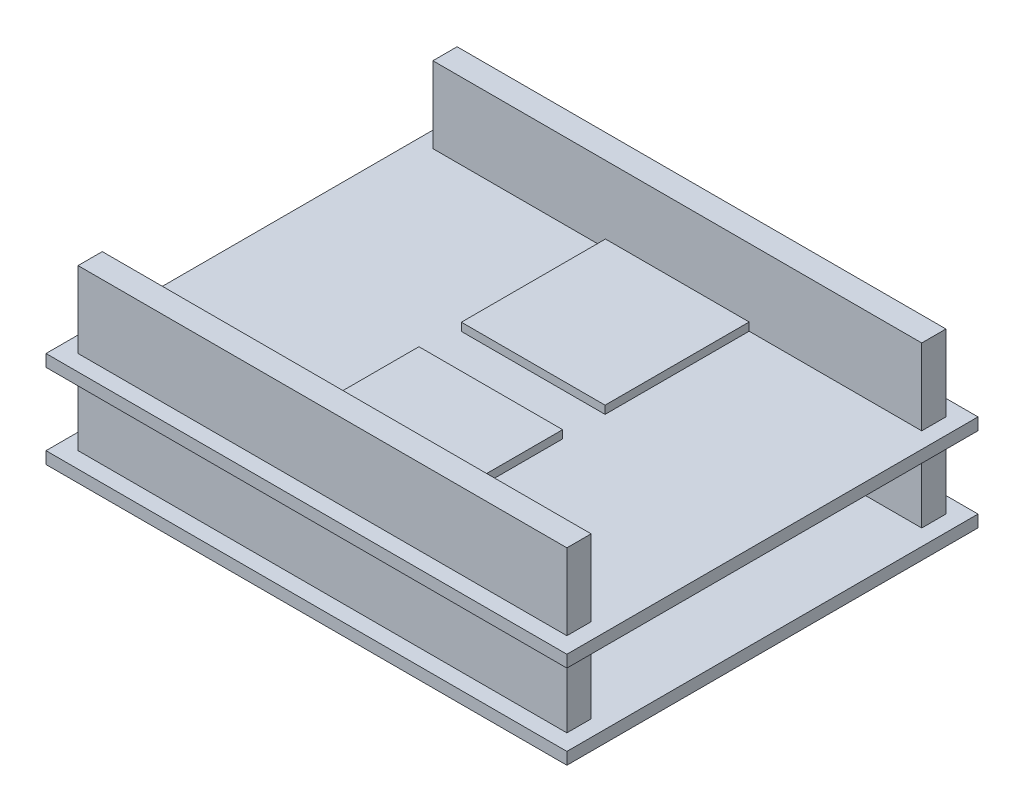
ISO-10303-21;
HEADER;
FILE_DESCRIPTION(('STEP AP214'),'2;1');
FILE_NAME('part.step','',(''),(''),'','','');
FILE_SCHEMA(('AUTOMOTIVE_DESIGN { 1 0 10303 214 1 1 1 1 }'));
ENDSEC;
DATA;
#1=APPLICATION_CONTEXT('core data for automotive mechanical design processes');
#2=APPLICATION_PROTOCOL_DEFINITION('international standard','automotive_design',2000,#1);
#3=PRODUCT_CONTEXT('',#1,'mechanical');
#4=PRODUCT('Part','Part','',(#3));
#5=PRODUCT_RELATED_PRODUCT_CATEGORY('part','',(#4));
#6=PRODUCT_DEFINITION_FORMATION('','',#4);
#7=PRODUCT_DEFINITION_CONTEXT('part definition',#1,'design');
#8=PRODUCT_DEFINITION('design','',#6,#7);
#9=PRODUCT_DEFINITION_SHAPE('','',#8);
#10=(LENGTH_UNIT() NAMED_UNIT(*) SI_UNIT(.MILLI.,.METRE.));
#11=(NAMED_UNIT(*) PLANE_ANGLE_UNIT() SI_UNIT($,.RADIAN.));
#12=(NAMED_UNIT(*) SI_UNIT($,.STERADIAN.) SOLID_ANGLE_UNIT());
#13=UNCERTAINTY_MEASURE_WITH_UNIT(LENGTH_MEASURE(1.E-05),#10,'distance_accuracy_value','');
#14=(GEOMETRIC_REPRESENTATION_CONTEXT(3) GLOBAL_UNCERTAINTY_ASSIGNED_CONTEXT((#13)) GLOBAL_UNIT_ASSIGNED_CONTEXT((#10,
#11,#12)) REPRESENTATION_CONTEXT('',''));
#15=CARTESIAN_POINT('',(0.,0.,0.));
#16=DIRECTION('',(0.,0.,1.));
#17=DIRECTION('',(1.,0.,0.));
#18=AXIS2_PLACEMENT_3D('',#15,#16,#17);
#19=CARTESIAN_POINT('',(0.,1.5,0.));
#20=DIRECTION('',(0.,-1.,0.));
#21=DIRECTION('',(0.,0.,-1.));
#22=AXIS2_PLACEMENT_3D('',#19,#20,#21);
#23=PLANE('',#22);
#24=DIRECTION('',(-1.,0.,0.));
#25=VECTOR('',#24,1.);
#26=CARTESIAN_POINT('',(0.,1.5,20.627385850554));
#27=LINE('',#26,#25);
#28=CARTESIAN_POINT('',(-8.96479878415247,1.5,20.627385850554));
#29=VERTEX_POINT('',#28);
#30=CARTESIAN_POINT('',(-30.5,1.5,20.627385850554));
#31=VERTEX_POINT('',#30);
#32=EDGE_CURVE('E368',#29,#31,#27,.T.);
#33=ORIENTED_EDGE('',*,*,#32,.F.);
#34=DIRECTION('',(0.,0.,1.));
#35=VECTOR('',#34,1.);
#36=CARTESIAN_POINT('',(-8.96479878415247,1.5,20.6499999999998));
#37=LINE('',#36,#35);
#38=CARTESIAN_POINT('',(-8.96479878415238,1.5,2.64999999999977));
#39=VERTEX_POINT('',#38);
#40=EDGE_CURVE('E384',#39,#29,#37,.T.);
#41=ORIENTED_EDGE('',*,*,#40,.F.);
#42=DIRECTION('',(-1.,0.,0.));
#43=VECTOR('',#42,1.);
#44=CARTESIAN_POINT('',(-8.96479878415238,1.5,2.64999999999977));
#45=LINE('',#44,#43);
#46=CARTESIAN_POINT('',(8.96479878415235,1.5,2.64999999999986));
#47=VERTEX_POINT('',#46);
#48=EDGE_CURVE('E391',#47,#39,#45,.T.);
#49=ORIENTED_EDGE('',*,*,#48,.F.);
#50=DIRECTION('',(0.,0.,-1.));
#51=VECTOR('',#50,1.);
#52=CARTESIAN_POINT('',(8.96479878415226,1.5,20.6499999999999));
#53=LINE('',#52,#51);
#54=CARTESIAN_POINT('',(8.96479878415226,1.5,20.627385850554));
#55=VERTEX_POINT('',#54);
#56=EDGE_CURVE('E380',#55,#47,#53,.T.);
#57=ORIENTED_EDGE('',*,*,#56,.F.);
#58=CARTESIAN_POINT('',(30.5,1.5,20.627385850554));
#59=VERTEX_POINT('',#58);
#60=EDGE_CURVE('E370',#59,#55,#27,.T.);
#61=ORIENTED_EDGE('',*,*,#60,.F.);
#62=DIRECTION('',(0.,0.,-1.));
#63=VECTOR('',#62,1.);
#64=CARTESIAN_POINT('',(30.5,1.5,0.));
#65=LINE('',#64,#63);
#66=CARTESIAN_POINT('',(30.5,1.5,23.65));
#67=VERTEX_POINT('',#66);
#68=EDGE_CURVE('E376',#67,#59,#65,.T.);
#69=ORIENTED_EDGE('',*,*,#68,.F.);
#70=DIRECTION('',(1.,0.,0.));
#71=VECTOR('',#70,1.);
#72=CARTESIAN_POINT('',(0.,1.5,23.65));
#73=LINE('',#72,#71);
#74=CARTESIAN_POINT('',(-30.5,1.5,23.65));
#75=VERTEX_POINT('',#74);
#76=EDGE_CURVE('E374',#75,#67,#73,.T.);
#77=ORIENTED_EDGE('',*,*,#76,.F.);
#78=DIRECTION('',(0.,0.,1.));
#79=VECTOR('',#78,1.);
#80=CARTESIAN_POINT('',(-30.5,1.5,0.));
#81=LINE('',#80,#79);
#82=EDGE_CURVE('E378',#31,#75,#81,.T.);
#83=ORIENTED_EDGE('',*,*,#82,.F.);
#84=EDGE_LOOP('',(#33,#41,#49,#57,#61,#69,#77,#83));
#85=FACE_BOUND('',#84,.T.);
#86=DIRECTION('',(0.,0.,1.));
#87=VECTOR('',#86,1.);
#88=CARTESIAN_POINT('',(-32.5,1.5,-25.65));
#89=LINE('',#88,#87);
#90=CARTESIAN_POINT('',(-32.5,1.5,-25.65));
#91=VERTEX_POINT('',#90);
#92=CARTESIAN_POINT('',(-32.5,1.5,25.65));
#93=VERTEX_POINT('',#92);
#94=EDGE_CURVE('E423',#91,#93,#89,.T.);
#95=ORIENTED_EDGE('',*,*,#94,.T.);
#96=DIRECTION('',(1.,0.,0.));
#97=VECTOR('',#96,1.);
#98=CARTESIAN_POINT('',(32.5,1.5,25.65));
#99=LINE('',#98,#97);
#100=CARTESIAN_POINT('',(32.5,1.5,25.65));
#101=VERTEX_POINT('',#100);
#102=EDGE_CURVE('E426',#93,#101,#99,.T.);
#103=ORIENTED_EDGE('',*,*,#102,.T.);
#104=DIRECTION('',(0.,0.,-1.));
#105=VECTOR('',#104,1.);
#106=CARTESIAN_POINT('',(32.5,1.5,-25.65));
#107=LINE('',#106,#105);
#108=CARTESIAN_POINT('',(32.5,1.5,-25.65));
#109=VERTEX_POINT('',#108);
#110=EDGE_CURVE('E429',#101,#109,#107,.T.);
#111=ORIENTED_EDGE('',*,*,#110,.T.);
#112=DIRECTION('',(-1.,0.,0.));
#113=VECTOR('',#112,1.);
#114=CARTESIAN_POINT('',(32.5,1.5,-25.65));
#115=LINE('',#114,#113);
#116=EDGE_CURVE('E431',#109,#91,#115,.T.);
#117=ORIENTED_EDGE('',*,*,#116,.T.);
#118=EDGE_LOOP('',(#95,#103,#111,#117));
#119=FACE_BOUND('',#118,.T.);
#120=DIRECTION('',(1.,0.,0.));
#121=VECTOR('',#120,1.);
#122=CARTESIAN_POINT('',(0.,1.5,-20.627385850554));
#123=LINE('',#122,#121);
#124=CARTESIAN_POINT('',(8.96479878415236,1.5,-20.627385850554));
#125=VERTEX_POINT('',#124);
#126=CARTESIAN_POINT('',(30.5,1.5,-20.627385850554));
#127=VERTEX_POINT('',#126);
#128=EDGE_CURVE('E313',#125,#127,#123,.T.);
#129=ORIENTED_EDGE('',*,*,#128,.F.);
#130=DIRECTION('',(0.,0.,-1.));
#131=VECTOR('',#130,1.);
#132=CARTESIAN_POINT('',(8.96479878415236,1.5,-20.65));
#133=LINE('',#132,#131);
#134=CARTESIAN_POINT('',(8.96479878415237,1.5,-2.65000000000001));
#135=VERTEX_POINT('',#134);
#136=EDGE_CURVE('E401',#135,#125,#133,.T.);
#137=ORIENTED_EDGE('',*,*,#136,.F.);
#138=DIRECTION('',(1.,0.,0.));
#139=VECTOR('',#138,1.);
#140=CARTESIAN_POINT('',(-8.96479878415236,1.5,-2.65000000000001));
#141=LINE('',#140,#139);
#142=CARTESIAN_POINT('',(-8.96479878415236,1.5,-2.65000000000001));
#143=VERTEX_POINT('',#142);
#144=EDGE_CURVE('E406',#143,#135,#141,.T.);
#145=ORIENTED_EDGE('',*,*,#144,.F.);
#146=DIRECTION('',(0.,0.,1.));
#147=VECTOR('',#146,1.);
#148=CARTESIAN_POINT('',(-8.96479878415236,1.5,-20.65));
#149=LINE('',#148,#147);
#150=CARTESIAN_POINT('',(-8.96479878415236,1.5,-20.627385850554));
#151=VERTEX_POINT('',#150);
#152=EDGE_CURVE('E413',#151,#143,#149,.T.);
#153=ORIENTED_EDGE('',*,*,#152,.F.);
#154=CARTESIAN_POINT('',(-30.5,1.5,-20.627385850554));
#155=VERTEX_POINT('',#154);
#156=EDGE_CURVE('E315',#155,#151,#123,.T.);
#157=ORIENTED_EDGE('',*,*,#156,.F.);
#158=DIRECTION('',(0.,0.,1.));
#159=VECTOR('',#158,1.);
#160=CARTESIAN_POINT('',(-30.5,1.5,0.));
#161=LINE('',#160,#159);
#162=CARTESIAN_POINT('',(-30.5,1.5,-23.65));
#163=VERTEX_POINT('',#162);
#164=EDGE_CURVE('E319',#163,#155,#161,.T.);
#165=ORIENTED_EDGE('',*,*,#164,.F.);
#166=DIRECTION('',(-1.,0.,0.));
#167=VECTOR('',#166,1.);
#168=CARTESIAN_POINT('',(0.,1.5,-23.65));
#169=LINE('',#168,#167);
#170=CARTESIAN_POINT('',(30.5,1.5,-23.65));
#171=VERTEX_POINT('',#170);
#172=EDGE_CURVE('E323',#171,#163,#169,.T.);
#173=ORIENTED_EDGE('',*,*,#172,.F.);
#174=DIRECTION('',(0.,0.,-1.));
#175=VECTOR('',#174,1.);
#176=CARTESIAN_POINT('',(30.5,1.5,0.));
#177=LINE('',#176,#175);
#178=EDGE_CURVE('E321',#127,#171,#177,.T.);
#179=ORIENTED_EDGE('',*,*,#178,.F.);
#180=EDGE_LOOP('',(#129,#137,#145,#153,#157,#165,#173,#179));
#181=FACE_BOUND('',#180,.T.);
#182=ADVANCED_FACE('F33',(#85,#119,#181),#23,.F.);
#183=CARTESIAN_POINT('',(0.,0.,0.));
#184=DIRECTION('',(0.,-1.,0.));
#185=DIRECTION('',(0.,0.,-1.));
#186=AXIS2_PLACEMENT_3D('',#183,#184,#185);
#187=PLANE('',#186);
#188=DIRECTION('',(-1.,0.,0.));
#189=VECTOR('',#188,1.);
#190=CARTESIAN_POINT('',(0.,0.,20.627385850554));
#191=LINE('',#190,#189);
#192=CARTESIAN_POINT('',(30.5,0.,20.627385850554));
#193=VERTEX_POINT('',#192);
#194=CARTESIAN_POINT('',(-30.5,0.,20.627385850554));
#195=VERTEX_POINT('',#194);
#196=EDGE_CURVE('E371',#193,#195,#191,.T.);
#197=ORIENTED_EDGE('',*,*,#196,.T.);
#198=DIRECTION('',(0.,0.,1.));
#199=VECTOR('',#198,1.);
#200=CARTESIAN_POINT('',(-30.5,0.,0.));
#201=LINE('',#200,#199);
#202=CARTESIAN_POINT('',(-30.5,0.,23.65));
#203=VERTEX_POINT('',#202);
#204=EDGE_CURVE('E461',#195,#203,#201,.T.);
#205=ORIENTED_EDGE('',*,*,#204,.T.);
#206=DIRECTION('',(1.,0.,0.));
#207=VECTOR('',#206,1.);
#208=CARTESIAN_POINT('',(0.,0.,23.65));
#209=LINE('',#208,#207);
#210=CARTESIAN_POINT('',(30.5,0.,23.65));
#211=VERTEX_POINT('',#210);
#212=EDGE_CURVE('E455',#203,#211,#209,.T.);
#213=ORIENTED_EDGE('',*,*,#212,.T.);
#214=DIRECTION('',(0.,0.,-1.));
#215=VECTOR('',#214,1.);
#216=CARTESIAN_POINT('',(30.5,0.,0.));
#217=LINE('',#216,#215);
#218=EDGE_CURVE('E458',#211,#193,#217,.T.);
#219=ORIENTED_EDGE('',*,*,#218,.T.);
#220=EDGE_LOOP('',(#197,#205,#213,#219));
#221=FACE_BOUND('',#220,.T.);
#222=DIRECTION('',(0.,0.,1.));
#223=VECTOR('',#222,1.);
#224=CARTESIAN_POINT('',(-32.5,0.,-25.65));
#225=LINE('',#224,#223);
#226=CARTESIAN_POINT('',(-32.5,0.,-25.65));
#227=VERTEX_POINT('',#226);
#228=CARTESIAN_POINT('',(-32.5,0.,25.65));
#229=VERTEX_POINT('',#228);
#230=EDGE_CURVE('E422',#227,#229,#225,.T.);
#231=ORIENTED_EDGE('',*,*,#230,.F.);
#232=DIRECTION('',(-1.,0.,0.));
#233=VECTOR('',#232,1.);
#234=CARTESIAN_POINT('',(32.5,0.,-25.65));
#235=LINE('',#234,#233);
#236=CARTESIAN_POINT('',(32.5,0.,-25.65));
#237=VERTEX_POINT('',#236);
#238=EDGE_CURVE('E427',#237,#227,#235,.T.);
#239=ORIENTED_EDGE('',*,*,#238,.F.);
#240=DIRECTION('',(0.,0.,-1.));
#241=VECTOR('',#240,1.);
#242=CARTESIAN_POINT('',(32.5,0.,-25.65));
#243=LINE('',#242,#241);
#244=CARTESIAN_POINT('',(32.5,0.,25.65));
#245=VERTEX_POINT('',#244);
#246=EDGE_CURVE('E438',#245,#237,#243,.T.);
#247=ORIENTED_EDGE('',*,*,#246,.F.);
#248=DIRECTION('',(1.,0.,0.));
#249=VECTOR('',#248,1.);
#250=CARTESIAN_POINT('',(32.5,0.,25.65));
#251=LINE('',#250,#249);
#252=EDGE_CURVE('E436',#229,#245,#251,.T.);
#253=ORIENTED_EDGE('',*,*,#252,.F.);
#254=EDGE_LOOP('',(#231,#239,#247,#253));
#255=FACE_BOUND('',#254,.T.);
#256=DIRECTION('',(0.,0.,-1.));
#257=VECTOR('',#256,1.);
#258=CARTESIAN_POINT('',(30.5,0.,0.));
#259=LINE('',#258,#257);
#260=CARTESIAN_POINT('',(30.5,0.,-20.627385850554));
#261=VERTEX_POINT('',#260);
#262=CARTESIAN_POINT('',(30.5,0.,-23.65));
#263=VERTEX_POINT('',#262);
#264=EDGE_CURVE('E41',#261,#263,#259,.T.);
#265=ORIENTED_EDGE('',*,*,#264,.T.);
#266=DIRECTION('',(-1.,0.,0.));
#267=VECTOR('',#266,1.);
#268=CARTESIAN_POINT('',(0.,0.,-23.65));
#269=LINE('',#268,#267);
#270=CARTESIAN_POINT('',(-30.5,0.,-23.65));
#271=VERTEX_POINT('',#270);
#272=EDGE_CURVE('E11',#263,#271,#269,.T.);
#273=ORIENTED_EDGE('',*,*,#272,.T.);
#274=DIRECTION('',(0.,0.,1.));
#275=VECTOR('',#274,1.);
#276=CARTESIAN_POINT('',(-30.5,0.,0.));
#277=LINE('',#276,#275);
#278=CARTESIAN_POINT('',(-30.5,0.,-20.627385850554));
#279=VERTEX_POINT('',#278);
#280=EDGE_CURVE('E466',#271,#279,#277,.T.);
#281=ORIENTED_EDGE('',*,*,#280,.T.);
#282=DIRECTION('',(1.,0.,0.));
#283=VECTOR('',#282,1.);
#284=CARTESIAN_POINT('',(0.,0.,-20.627385850554));
#285=LINE('',#284,#283);
#286=EDGE_CURVE('E316',#279,#261,#285,.T.);
#287=ORIENTED_EDGE('',*,*,#286,.T.);
#288=EDGE_LOOP('',(#265,#273,#281,#287));
#289=FACE_BOUND('',#288,.T.);
#290=ADVANCED_FACE('F470',(#221,#255,#289),#187,.T.);
#291=CARTESIAN_POINT('',(8.96479878415236,2.5,-20.65));
#292=DIRECTION('',(-1.,0.,0.));
#293=DIRECTION('',(0.,0.,1.));
#294=AXIS2_PLACEMENT_3D('',#291,#292,#293);
#295=PLANE('',#294);
#296=DIRECTION('',(0.,-1.,0.));
#297=VECTOR('',#296,1.);
#298=CARTESIAN_POINT('',(8.96479878415236,2.5,-20.627385850554));
#299=LINE('',#298,#297);
#300=CARTESIAN_POINT('',(8.96479878415237,2.5,-20.627385850554));
#301=VERTEX_POINT('',#300);
#302=EDGE_CURVE('E311',#301,#125,#299,.T.);
#303=ORIENTED_EDGE('',*,*,#302,.F.);
#304=DIRECTION('',(0.,0.,-1.));
#305=VECTOR('',#304,1.);
#306=CARTESIAN_POINT('',(8.96479878415236,2.5,-20.65));
#307=LINE('',#306,#305);
#308=CARTESIAN_POINT('',(8.96479878415237,2.5,-2.65000000000001));
#309=VERTEX_POINT('',#308);
#310=EDGE_CURVE('E402',#309,#301,#307,.T.);
#311=ORIENTED_EDGE('',*,*,#310,.F.);
#312=DIRECTION('',(0.,-1.,0.));
#313=VECTOR('',#312,1.);
#314=CARTESIAN_POINT('',(8.96479878415237,2.5,-2.65000000000001));
#315=LINE('',#314,#313);
#316=EDGE_CURVE('E410',#309,#135,#315,.T.);
#317=ORIENTED_EDGE('',*,*,#316,.T.);
#318=ORIENTED_EDGE('',*,*,#136,.T.);
#319=EDGE_LOOP('',(#303,#311,#317,#318));
#320=FACE_BOUND('',#319,.T.);
#321=ADVANCED_FACE('F504',(#320),#295,.F.);
#322=CARTESIAN_POINT('',(-8.96479878415236,2.5,-20.65));
#323=DIRECTION('',(1.,0.,0.));
#324=DIRECTION('',(0.,0.,-1.));
#325=AXIS2_PLACEMENT_3D('',#322,#323,#324);
#326=PLANE('',#325);
#327=DIRECTION('',(0.,1.,0.));
#328=VECTOR('',#327,1.);
#329=CARTESIAN_POINT('',(-8.96479878415236,2.5,-20.627385850554));
#330=LINE('',#329,#328);
#331=CARTESIAN_POINT('',(-8.96479878415236,2.5,-20.627385850554));
#332=VERTEX_POINT('',#331);
#333=EDGE_CURVE('E56',#151,#332,#330,.T.);
#334=ORIENTED_EDGE('',*,*,#333,.F.);
#335=ORIENTED_EDGE('',*,*,#152,.T.);
#336=DIRECTION('',(0.,-1.,0.));
#337=VECTOR('',#336,1.);
#338=CARTESIAN_POINT('',(-8.96479878415236,2.5,-2.65000000000001));
#339=LINE('',#338,#337);
#340=CARTESIAN_POINT('',(-8.96479878415236,2.5,-2.65000000000001));
#341=VERTEX_POINT('',#340);
#342=EDGE_CURVE('E419',#341,#143,#339,.T.);
#343=ORIENTED_EDGE('',*,*,#342,.F.);
#344=DIRECTION('',(0.,0.,1.));
#345=VECTOR('',#344,1.);
#346=CARTESIAN_POINT('',(-8.96479878415236,2.5,-20.65));
#347=LINE('',#346,#345);
#348=EDGE_CURVE('E405',#332,#341,#347,.T.);
#349=ORIENTED_EDGE('',*,*,#348,.F.);
#350=EDGE_LOOP('',(#334,#335,#343,#349));
#351=FACE_BOUND('',#350,.T.);
#352=ADVANCED_FACE('F556',(#351),#326,.F.);
#353=CARTESIAN_POINT('',(0.,2.5,0.));
#354=DIRECTION('',(0.,1.,0.));
#355=DIRECTION('',(0.,0.,1.));
#356=AXIS2_PLACEMENT_3D('',#353,#354,#355);
#357=PLANE('',#356);
#358=ORIENTED_EDGE('',*,*,#310,.T.);
#359=DIRECTION('',(-1.,0.,0.));
#360=VECTOR('',#359,1.);
#361=CARTESIAN_POINT('',(0.,2.5,-20.627385850554));
#362=LINE('',#361,#360);
#363=EDGE_CURVE('E464',#301,#332,#362,.T.);
#364=ORIENTED_EDGE('',*,*,#363,.T.);
#365=ORIENTED_EDGE('',*,*,#348,.T.);
#366=DIRECTION('',(1.,0.,0.));
#367=VECTOR('',#366,1.);
#368=CARTESIAN_POINT('',(-8.96479878415236,2.5,-2.65000000000001));
#369=LINE('',#368,#367);
#370=EDGE_CURVE('E408',#341,#309,#369,.T.);
#371=ORIENTED_EDGE('',*,*,#370,.T.);
#372=EDGE_LOOP('',(#358,#364,#365,#371));
#373=FACE_BOUND('',#372,.T.);
#374=ADVANCED_FACE('F559',(#373),#357,.T.);
#375=CARTESIAN_POINT('',(8.96479878415226,2.5,20.6499999999999));
#376=DIRECTION('',(-1.,0.,0.));
#377=DIRECTION('',(0.,0.,1.));
#378=AXIS2_PLACEMENT_3D('',#375,#376,#377);
#379=PLANE('',#378);
#380=DIRECTION('',(0.,1.,0.));
#381=VECTOR('',#380,1.);
#382=CARTESIAN_POINT('',(8.96479878415226,2.5,20.627385850554));
#383=LINE('',#382,#381);
#384=CARTESIAN_POINT('',(8.96479878415226,2.5,20.627385850554));
#385=VERTEX_POINT('',#384);
#386=EDGE_CURVE('E366',#55,#385,#383,.T.);
#387=ORIENTED_EDGE('',*,*,#386,.F.);
#388=ORIENTED_EDGE('',*,*,#56,.T.);
#389=DIRECTION('',(0.,-1.,0.));
#390=VECTOR('',#389,1.);
#391=CARTESIAN_POINT('',(8.96479878415235,2.5,2.64999999999986));
#392=LINE('',#391,#390);
#393=CARTESIAN_POINT('',(8.96479878415235,2.5,2.64999999999986));
#394=VERTEX_POINT('',#393);
#395=EDGE_CURVE('E398',#394,#47,#392,.T.);
#396=ORIENTED_EDGE('',*,*,#395,.F.);
#397=DIRECTION('',(0.,0.,-1.));
#398=VECTOR('',#397,1.);
#399=CARTESIAN_POINT('',(8.96479878415226,2.5,20.6499999999999));
#400=LINE('',#399,#398);
#401=EDGE_CURVE('E381',#385,#394,#400,.T.);
#402=ORIENTED_EDGE('',*,*,#401,.F.);
#403=EDGE_LOOP('',(#387,#388,#396,#402));
#404=FACE_BOUND('',#403,.T.);
#405=ADVANCED_FACE('F604',(#404),#379,.F.);
#406=CARTESIAN_POINT('',(-8.96479878415247,2.5,20.6499999999998));
#407=DIRECTION('',(1.,0.,0.));
#408=DIRECTION('',(0.,0.,-1.));
#409=AXIS2_PLACEMENT_3D('',#406,#407,#408);
#410=PLANE('',#409);
#411=DIRECTION('',(0.,-1.,0.));
#412=VECTOR('',#411,1.);
#413=CARTESIAN_POINT('',(-8.96479878415247,2.5,20.627385850554));
#414=LINE('',#413,#412);
#415=CARTESIAN_POINT('',(-8.96479878415247,2.5,20.627385850554));
#416=VERTEX_POINT('',#415);
#417=EDGE_CURVE('E364',#416,#29,#414,.T.);
#418=ORIENTED_EDGE('',*,*,#417,.F.);
#419=DIRECTION('',(0.,0.,1.));
#420=VECTOR('',#419,1.);
#421=CARTESIAN_POINT('',(-8.96479878415247,2.5,20.6499999999998));
#422=LINE('',#421,#420);
#423=CARTESIAN_POINT('',(-8.96479878415238,2.5,2.64999999999977));
#424=VERTEX_POINT('',#423);
#425=EDGE_CURVE('E386',#424,#416,#422,.T.);
#426=ORIENTED_EDGE('',*,*,#425,.F.);
#427=DIRECTION('',(0.,-1.,0.));
#428=VECTOR('',#427,1.);
#429=CARTESIAN_POINT('',(-8.96479878415238,2.5,2.64999999999977));
#430=LINE('',#429,#428);
#431=EDGE_CURVE('E389',#424,#39,#430,.T.);
#432=ORIENTED_EDGE('',*,*,#431,.T.);
#433=ORIENTED_EDGE('',*,*,#40,.T.);
#434=EDGE_LOOP('',(#418,#426,#432,#433));
#435=FACE_BOUND('',#434,.T.);
#436=ADVANCED_FACE('F600',(#435),#410,.F.);
#437=CARTESIAN_POINT('',(0.,2.5,0.));
#438=DIRECTION('',(0.,1.,0.));
#439=DIRECTION('',(0.,0.,1.));
#440=AXIS2_PLACEMENT_3D('',#437,#438,#439);
#441=PLANE('',#440);
#442=ORIENTED_EDGE('',*,*,#425,.T.);
#443=DIRECTION('',(1.,0.,0.));
#444=VECTOR('',#443,1.);
#445=CARTESIAN_POINT('',(0.,2.5,20.627385850554));
#446=LINE('',#445,#444);
#447=EDGE_CURVE('E452',#416,#385,#446,.T.);
#448=ORIENTED_EDGE('',*,*,#447,.T.);
#449=ORIENTED_EDGE('',*,*,#401,.T.);
#450=DIRECTION('',(-1.,0.,0.));
#451=VECTOR('',#450,1.);
#452=CARTESIAN_POINT('',(-8.96479878415238,2.5,2.64999999999977));
#453=LINE('',#452,#451);
#454=EDGE_CURVE('E383',#394,#424,#453,.T.);
#455=ORIENTED_EDGE('',*,*,#454,.T.);
#456=EDGE_LOOP('',(#442,#448,#449,#455));
#457=FACE_BOUND('',#456,.T.);
#458=ADVANCED_FACE('F526',(#457),#441,.T.);
#459=CARTESIAN_POINT('',(-32.5,1.5,-25.65));
#460=DIRECTION('',(1.,0.,0.));
#461=DIRECTION('',(0.,0.,-1.));
#462=AXIS2_PLACEMENT_3D('',#459,#460,#461);
#463=PLANE('',#462);
#464=ORIENTED_EDGE('',*,*,#230,.T.);
#465=DIRECTION('',(0.,-1.,0.));
#466=VECTOR('',#465,1.);
#467=CARTESIAN_POINT('',(-32.5,1.5,25.65));
#468=LINE('',#467,#466);
#469=EDGE_CURVE('E449',#93,#229,#468,.T.);
#470=ORIENTED_EDGE('',*,*,#469,.F.);
#471=ORIENTED_EDGE('',*,*,#94,.F.);
#472=DIRECTION('',(0.,-1.,0.));
#473=VECTOR('',#472,1.);
#474=CARTESIAN_POINT('',(-32.5,1.5,-25.65));
#475=LINE('',#474,#473);
#476=EDGE_CURVE('E433',#91,#227,#475,.T.);
#477=ORIENTED_EDGE('',*,*,#476,.T.);
#478=EDGE_LOOP('',(#464,#470,#471,#477));
#479=FACE_BOUND('',#478,.T.);
#480=ADVANCED_FACE('F35',(#479),#463,.F.);
#481=CARTESIAN_POINT('',(32.5,1.5,25.65));
#482=DIRECTION('',(0.,0.,-1.));
#483=DIRECTION('',(-1.,0.,0.));
#484=AXIS2_PLACEMENT_3D('',#481,#482,#483);
#485=PLANE('',#484);
#486=ORIENTED_EDGE('',*,*,#252,.T.);
#487=DIRECTION('',(0.,-1.,0.));
#488=VECTOR('',#487,1.);
#489=CARTESIAN_POINT('',(32.5,1.5,25.65));
#490=LINE('',#489,#488);
#491=EDGE_CURVE('E446',#101,#245,#490,.T.);
#492=ORIENTED_EDGE('',*,*,#491,.F.);
#493=ORIENTED_EDGE('',*,*,#102,.F.);
#494=ORIENTED_EDGE('',*,*,#469,.T.);
#495=EDGE_LOOP('',(#486,#492,#493,#494));
#496=FACE_BOUND('',#495,.T.);
#497=ADVANCED_FACE('F519',(#496),#485,.F.);
#498=CARTESIAN_POINT('',(32.5,1.5,-25.65));
#499=DIRECTION('',(-1.,0.,0.));
#500=DIRECTION('',(0.,0.,1.));
#501=AXIS2_PLACEMENT_3D('',#498,#499,#500);
#502=PLANE('',#501);
#503=ORIENTED_EDGE('',*,*,#246,.T.);
#504=DIRECTION('',(0.,-1.,0.));
#505=VECTOR('',#504,1.);
#506=CARTESIAN_POINT('',(32.5,1.5,-25.65));
#507=LINE('',#506,#505);
#508=EDGE_CURVE('E443',#109,#237,#507,.T.);
#509=ORIENTED_EDGE('',*,*,#508,.F.);
#510=ORIENTED_EDGE('',*,*,#110,.F.);
#511=ORIENTED_EDGE('',*,*,#491,.T.);
#512=EDGE_LOOP('',(#503,#509,#510,#511));
#513=FACE_BOUND('',#512,.T.);
#514=ADVANCED_FACE('F516',(#513),#502,.F.);
#515=CARTESIAN_POINT('',(32.5,1.5,-25.65));
#516=DIRECTION('',(0.,0.,1.));
#517=DIRECTION('',(1.,0.,0.));
#518=AXIS2_PLACEMENT_3D('',#515,#516,#517);
#519=PLANE('',#518);
#520=ORIENTED_EDGE('',*,*,#238,.T.);
#521=ORIENTED_EDGE('',*,*,#476,.F.);
#522=ORIENTED_EDGE('',*,*,#116,.F.);
#523=ORIENTED_EDGE('',*,*,#508,.T.);
#524=EDGE_LOOP('',(#520,#521,#522,#523));
#525=FACE_BOUND('',#524,.T.);
#526=ADVANCED_FACE('F512',(#525),#519,.F.);
#527=CARTESIAN_POINT('',(-8.96479878415236,2.5,-2.65000000000001));
#528=DIRECTION('',(0.,0.,-1.));
#529=DIRECTION('',(-1.,0.,0.));
#530=AXIS2_PLACEMENT_3D('',#527,#528,#529);
#531=PLANE('',#530);
#532=ORIENTED_EDGE('',*,*,#144,.T.);
#533=ORIENTED_EDGE('',*,*,#316,.F.);
#534=ORIENTED_EDGE('',*,*,#370,.F.);
#535=ORIENTED_EDGE('',*,*,#342,.T.);
#536=EDGE_LOOP('',(#532,#533,#534,#535));
#537=FACE_BOUND('',#536,.T.);
#538=ADVANCED_FACE('F515',(#537),#531,.F.);
#539=CARTESIAN_POINT('',(-8.96479878415238,2.5,2.64999999999977));
#540=DIRECTION('',(0.,0.,1.));
#541=DIRECTION('',(1.,0.,0.));
#542=AXIS2_PLACEMENT_3D('',#539,#540,#541);
#543=PLANE('',#542);
#544=ORIENTED_EDGE('',*,*,#48,.T.);
#545=ORIENTED_EDGE('',*,*,#431,.F.);
#546=ORIENTED_EDGE('',*,*,#454,.F.);
#547=ORIENTED_EDGE('',*,*,#395,.T.);
#548=EDGE_LOOP('',(#544,#545,#546,#547));
#549=FACE_BOUND('',#548,.T.);
#550=ADVANCED_FACE('F578',(#549),#543,.F.);
#551=CARTESIAN_POINT('',(0.,11.,0.));
#552=DIRECTION('',(0.,-1.,0.));
#553=DIRECTION('',(0.,0.,-1.));
#554=AXIS2_PLACEMENT_3D('',#551,#552,#553);
#555=PLANE('',#554);
#556=DIRECTION('',(0.,0.,-1.));
#557=VECTOR('',#556,1.);
#558=CARTESIAN_POINT('',(-30.5,11.,23.65));
#559=LINE('',#558,#557);
#560=CARTESIAN_POINT('',(-30.5,11.,23.65));
#561=VERTEX_POINT('',#560);
#562=CARTESIAN_POINT('',(-30.5,11.,20.627385850554));
#563=VERTEX_POINT('',#562);
#564=EDGE_CURVE('E325',#561,#563,#559,.T.);
#565=ORIENTED_EDGE('',*,*,#564,.F.);
#566=DIRECTION('',(-1.,0.,0.));
#567=VECTOR('',#566,1.);
#568=CARTESIAN_POINT('',(-30.5,11.,23.65));
#569=LINE('',#568,#567);
#570=CARTESIAN_POINT('',(30.5,11.,23.65));
#571=VERTEX_POINT('',#570);
#572=EDGE_CURVE('E334',#571,#561,#569,.T.);
#573=ORIENTED_EDGE('',*,*,#572,.F.);
#574=DIRECTION('',(0.,0.,1.));
#575=VECTOR('',#574,1.);
#576=CARTESIAN_POINT('',(30.5,11.,23.65));
#577=LINE('',#576,#575);
#578=CARTESIAN_POINT('',(30.5,11.,20.627385850554));
#579=VERTEX_POINT('',#578);
#580=EDGE_CURVE('E331',#579,#571,#577,.T.);
#581=ORIENTED_EDGE('',*,*,#580,.F.);
#582=DIRECTION('',(1.,0.,0.));
#583=VECTOR('',#582,1.);
#584=CARTESIAN_POINT('',(-30.5,11.,20.627385850554));
#585=LINE('',#584,#583);
#586=EDGE_CURVE('E328',#563,#579,#585,.T.);
#587=ORIENTED_EDGE('',*,*,#586,.F.);
#588=EDGE_LOOP('',(#565,#573,#581,#587));
#589=FACE_BOUND('',#588,.T.);
#590=ADVANCED_FACE('F574',(#589),#555,.F.);
#591=CARTESIAN_POINT('',(-30.5,-9.,20.627385850554));
#592=DIRECTION('',(0.,0.,1.));
#593=DIRECTION('',(1.,0.,0.));
#594=AXIS2_PLACEMENT_3D('',#591,#592,#593);
#595=PLANE('',#594);
#596=DIRECTION('',(0.,1.,0.));
#597=VECTOR('',#596,1.);
#598=CARTESIAN_POINT('',(30.5,-9.,20.627385850554));
#599=LINE('',#598,#597);
#600=EDGE_CURVE('E356',#59,#579,#599,.T.);
#601=ORIENTED_EDGE('',*,*,#600,.F.);
#602=ORIENTED_EDGE('',*,*,#60,.T.);
#603=ORIENTED_EDGE('',*,*,#386,.T.);
#604=ORIENTED_EDGE('',*,*,#447,.F.);
#605=ORIENTED_EDGE('',*,*,#417,.T.);
#606=ORIENTED_EDGE('',*,*,#32,.T.);
#607=DIRECTION('',(0.,1.,0.));
#608=VECTOR('',#607,1.);
#609=CARTESIAN_POINT('',(-30.5,-9.,20.627385850554));
#610=LINE('',#609,#608);
#611=EDGE_CURVE('E360',#31,#563,#610,.T.);
#612=ORIENTED_EDGE('',*,*,#611,.T.);
#613=ORIENTED_EDGE('',*,*,#586,.T.);
#614=EDGE_LOOP('',(#601,#602,#603,#604,#605,#606,#612,#613));
#615=FACE_BOUND('',#614,.T.);
#616=ADVANCED_FACE('F577',(#615),#595,.F.);
#617=CARTESIAN_POINT('',(-30.5,-9.,23.65));
#618=DIRECTION('',(0.,0.,-1.));
#619=DIRECTION('',(-1.,0.,0.));
#620=AXIS2_PLACEMENT_3D('',#617,#618,#619);
#621=PLANE('',#620);
#622=DIRECTION('',(0.,1.,0.));
#623=VECTOR('',#622,1.);
#624=CARTESIAN_POINT('',(-30.5,-9.,23.65));
#625=LINE('',#624,#623);
#626=EDGE_CURVE('E349',#75,#561,#625,.T.);
#627=ORIENTED_EDGE('',*,*,#626,.F.);
#628=ORIENTED_EDGE('',*,*,#76,.T.);
#629=DIRECTION('',(0.,1.,0.));
#630=VECTOR('',#629,1.);
#631=CARTESIAN_POINT('',(30.5,-9.,23.65));
#632=LINE('',#631,#630);
#633=EDGE_CURVE('E353',#67,#571,#632,.T.);
#634=ORIENTED_EDGE('',*,*,#633,.T.);
#635=ORIENTED_EDGE('',*,*,#572,.T.);
#636=EDGE_LOOP('',(#627,#628,#634,#635));
#637=FACE_BOUND('',#636,.T.);
#638=ADVANCED_FACE('F584',(#637),#621,.F.);
#639=CARTESIAN_POINT('',(30.5,-9.,23.65));
#640=DIRECTION('',(-1.,0.,0.));
#641=DIRECTION('',(0.,0.,1.));
#642=AXIS2_PLACEMENT_3D('',#639,#640,#641);
#643=PLANE('',#642);
#644=ORIENTED_EDGE('',*,*,#633,.F.);
#645=ORIENTED_EDGE('',*,*,#68,.T.);
#646=ORIENTED_EDGE('',*,*,#600,.T.);
#647=ORIENTED_EDGE('',*,*,#580,.T.);
#648=EDGE_LOOP('',(#644,#645,#646,#647));
#649=FACE_BOUND('',#648,.T.);
#650=ADVANCED_FACE('F589',(#649),#643,.F.);
#651=CARTESIAN_POINT('',(-30.5,-9.,23.65));
#652=DIRECTION('',(1.,0.,0.));
#653=DIRECTION('',(0.,0.,-1.));
#654=AXIS2_PLACEMENT_3D('',#651,#652,#653);
#655=PLANE('',#654);
#656=ORIENTED_EDGE('',*,*,#611,.F.);
#657=ORIENTED_EDGE('',*,*,#82,.T.);
#658=ORIENTED_EDGE('',*,*,#626,.T.);
#659=ORIENTED_EDGE('',*,*,#564,.T.);
#660=EDGE_LOOP('',(#656,#657,#658,#659));
#661=FACE_BOUND('',#660,.T.);
#662=ADVANCED_FACE('F596',(#661),#655,.F.);
#663=ORIENTED_EDGE('',*,*,#204,.F.);
#664=CARTESIAN_POINT('',(-30.5,-9.,20.627385850554));
#665=VERTEX_POINT('',#664);
#666=EDGE_CURVE('E361',#665,#195,#610,.T.);
#667=ORIENTED_EDGE('',*,*,#666,.F.);
#668=DIRECTION('',(0.,0.,-1.));
#669=VECTOR('',#668,1.);
#670=CARTESIAN_POINT('',(-30.5,-9.,23.65));
#671=LINE('',#670,#669);
#672=CARTESIAN_POINT('',(-30.5,-9.,23.65));
#673=VERTEX_POINT('',#672);
#674=EDGE_CURVE('E337',#673,#665,#671,.T.);
#675=ORIENTED_EDGE('',*,*,#674,.F.);
#676=EDGE_CURVE('E350',#673,#203,#625,.T.);
#677=ORIENTED_EDGE('',*,*,#676,.T.);
#678=EDGE_LOOP('',(#663,#667,#675,#677));
#679=FACE_BOUND('',#678,.T.);
#680=ADVANCED_FACE('F592',(#679),#655,.F.);
#681=ORIENTED_EDGE('',*,*,#196,.F.);
#682=CARTESIAN_POINT('',(30.5,-9.,20.627385850554));
#683=VERTEX_POINT('',#682);
#684=EDGE_CURVE('E357',#683,#193,#599,.T.);
#685=ORIENTED_EDGE('',*,*,#684,.F.);
#686=DIRECTION('',(1.,0.,0.));
#687=VECTOR('',#686,1.);
#688=CARTESIAN_POINT('',(-30.5,-9.,20.627385850554));
#689=LINE('',#688,#687);
#690=EDGE_CURVE('E340',#665,#683,#689,.T.);
#691=ORIENTED_EDGE('',*,*,#690,.F.);
#692=ORIENTED_EDGE('',*,*,#666,.T.);
#693=EDGE_LOOP('',(#681,#685,#691,#692));
#694=FACE_BOUND('',#693,.T.);
#695=ADVANCED_FACE('F587',(#694),#595,.F.);
#696=ORIENTED_EDGE('',*,*,#218,.F.);
#697=CARTESIAN_POINT('',(30.5,-9.,23.65));
#698=VERTEX_POINT('',#697);
#699=EDGE_CURVE('E354',#698,#211,#632,.T.);
#700=ORIENTED_EDGE('',*,*,#699,.F.);
#701=DIRECTION('',(0.,0.,1.));
#702=VECTOR('',#701,1.);
#703=CARTESIAN_POINT('',(30.5,-9.,23.65));
#704=LINE('',#703,#702);
#705=EDGE_CURVE('E343',#683,#698,#704,.T.);
#706=ORIENTED_EDGE('',*,*,#705,.F.);
#707=ORIENTED_EDGE('',*,*,#684,.T.);
#708=EDGE_LOOP('',(#696,#700,#706,#707));
#709=FACE_BOUND('',#708,.T.);
#710=ADVANCED_FACE('F582',(#709),#643,.F.);
#711=ORIENTED_EDGE('',*,*,#212,.F.);
#712=ORIENTED_EDGE('',*,*,#676,.F.);
#713=DIRECTION('',(-1.,0.,0.));
#714=VECTOR('',#713,1.);
#715=CARTESIAN_POINT('',(-30.5,-9.,23.65));
#716=LINE('',#715,#714);
#717=EDGE_CURVE('E346',#698,#673,#716,.T.);
#718=ORIENTED_EDGE('',*,*,#717,.F.);
#719=ORIENTED_EDGE('',*,*,#699,.T.);
#720=EDGE_LOOP('',(#711,#712,#718,#719));
#721=FACE_BOUND('',#720,.T.);
#722=ADVANCED_FACE('F566',(#721),#621,.F.);
#723=CARTESIAN_POINT('',(0.,11.,0.));
#724=DIRECTION('',(0.,-1.,0.));
#725=DIRECTION('',(0.,0.,-1.));
#726=AXIS2_PLACEMENT_3D('',#723,#724,#725);
#727=PLANE('',#726);
#728=DIRECTION('',(1.,0.,0.));
#729=VECTOR('',#728,1.);
#730=CARTESIAN_POINT('',(-30.5,11.,-23.65));
#731=LINE('',#730,#729);
#732=CARTESIAN_POINT('',(-30.5,11.,-23.65));
#733=VERTEX_POINT('',#732);
#734=CARTESIAN_POINT('',(30.5,11.,-23.65));
#735=VERTEX_POINT('',#734);
#736=EDGE_CURVE('E267',#733,#735,#731,.T.);
#737=ORIENTED_EDGE('',*,*,#736,.F.);
#738=DIRECTION('',(0.,0.,-1.));
#739=VECTOR('',#738,1.);
#740=CARTESIAN_POINT('',(-30.5,11.,-23.65));
#741=LINE('',#740,#739);
#742=CARTESIAN_POINT('',(-30.5,11.,-20.627385850554));
#743=VERTEX_POINT('',#742);
#744=EDGE_CURVE('E281',#743,#733,#741,.T.);
#745=ORIENTED_EDGE('',*,*,#744,.F.);
#746=DIRECTION('',(-1.,0.,0.));
#747=VECTOR('',#746,1.);
#748=CARTESIAN_POINT('',(-30.5,11.,-20.627385850554));
#749=LINE('',#748,#747);
#750=CARTESIAN_POINT('',(30.5,11.,-20.627385850554));
#751=VERTEX_POINT('',#750);
#752=EDGE_CURVE('E278',#751,#743,#749,.T.);
#753=ORIENTED_EDGE('',*,*,#752,.F.);
#754=DIRECTION('',(0.,0.,1.));
#755=VECTOR('',#754,1.);
#756=CARTESIAN_POINT('',(30.5,11.,-23.65));
#757=LINE('',#756,#755);
#758=EDGE_CURVE('E270',#735,#751,#757,.T.);
#759=ORIENTED_EDGE('',*,*,#758,.F.);
#760=EDGE_LOOP('',(#737,#745,#753,#759));
#761=FACE_BOUND('',#760,.T.);
#762=ADVANCED_FACE('F562',(#761),#727,.F.);
#763=CARTESIAN_POINT('',(-30.5,-9.,-20.627385850554));
#764=DIRECTION('',(0.,0.,-1.));
#765=DIRECTION('',(-1.,0.,0.));
#766=AXIS2_PLACEMENT_3D('',#763,#764,#765);
#767=PLANE('',#766);
#768=DIRECTION('',(0.,1.,0.));
#769=VECTOR('',#768,1.);
#770=CARTESIAN_POINT('',(-30.5,-9.,-20.627385850554));
#771=LINE('',#770,#769);
#772=EDGE_CURVE('E300',#155,#743,#771,.T.);
#773=ORIENTED_EDGE('',*,*,#772,.F.);
#774=ORIENTED_EDGE('',*,*,#156,.T.);
#775=ORIENTED_EDGE('',*,*,#333,.T.);
#776=ORIENTED_EDGE('',*,*,#363,.F.);
#777=ORIENTED_EDGE('',*,*,#302,.T.);
#778=ORIENTED_EDGE('',*,*,#128,.T.);
#779=DIRECTION('',(0.,1.,0.));
#780=VECTOR('',#779,1.);
#781=CARTESIAN_POINT('',(30.5,-9.,-20.627385850554));
#782=LINE('',#781,#780);
#783=EDGE_CURVE('E302',#127,#751,#782,.T.);
#784=ORIENTED_EDGE('',*,*,#783,.T.);
#785=ORIENTED_EDGE('',*,*,#752,.T.);
#786=EDGE_LOOP('',(#773,#774,#775,#776,#777,#778,#784,#785));
#787=FACE_BOUND('',#786,.T.);
#788=ADVANCED_FACE('F493',(#787),#767,.F.);
#789=CARTESIAN_POINT('',(-30.5,-9.,-23.65));
#790=DIRECTION('',(1.,0.,0.));
#791=DIRECTION('',(0.,0.,-1.));
#792=AXIS2_PLACEMENT_3D('',#789,#790,#791);
#793=PLANE('',#792);
#794=DIRECTION('',(0.,1.,0.));
#795=VECTOR('',#794,1.);
#796=CARTESIAN_POINT('',(-30.5,-9.,-23.65));
#797=LINE('',#796,#795);
#798=EDGE_CURVE('E296',#163,#733,#797,.T.);
#799=ORIENTED_EDGE('',*,*,#798,.F.);
#800=ORIENTED_EDGE('',*,*,#164,.T.);
#801=ORIENTED_EDGE('',*,*,#772,.T.);
#802=ORIENTED_EDGE('',*,*,#744,.T.);
#803=EDGE_LOOP('',(#799,#800,#801,#802));
#804=FACE_BOUND('',#803,.T.);
#805=ADVANCED_FACE('F486',(#804),#793,.F.);
#806=CARTESIAN_POINT('',(30.5,-9.,-23.65));
#807=DIRECTION('',(-1.,0.,0.));
#808=DIRECTION('',(0.,0.,1.));
#809=AXIS2_PLACEMENT_3D('',#806,#807,#808);
#810=PLANE('',#809);
#811=ORIENTED_EDGE('',*,*,#783,.F.);
#812=ORIENTED_EDGE('',*,*,#178,.T.);
#813=DIRECTION('',(0.,1.,0.));
#814=VECTOR('',#813,1.);
#815=CARTESIAN_POINT('',(30.5,-9.,-23.65));
#816=LINE('',#815,#814);
#817=EDGE_CURVE('E306',#171,#735,#816,.T.);
#818=ORIENTED_EDGE('',*,*,#817,.T.);
#819=ORIENTED_EDGE('',*,*,#758,.T.);
#820=EDGE_LOOP('',(#811,#812,#818,#819));
#821=FACE_BOUND('',#820,.T.);
#822=ADVANCED_FACE('F496',(#821),#810,.F.);
#823=CARTESIAN_POINT('',(-30.5,-9.,-23.65));
#824=DIRECTION('',(0.,0.,1.));
#825=DIRECTION('',(1.,0.,0.));
#826=AXIS2_PLACEMENT_3D('',#823,#824,#825);
#827=PLANE('',#826);
#828=ORIENTED_EDGE('',*,*,#817,.F.);
#829=ORIENTED_EDGE('',*,*,#172,.T.);
#830=ORIENTED_EDGE('',*,*,#798,.T.);
#831=ORIENTED_EDGE('',*,*,#736,.T.);
#832=EDGE_LOOP('',(#828,#829,#830,#831));
#833=FACE_BOUND('',#832,.T.);
#834=ADVANCED_FACE('F573',(#833),#827,.F.);
#835=ORIENTED_EDGE('',*,*,#272,.F.);
#836=CARTESIAN_POINT('',(30.5,-9.,-23.65));
#837=VERTEX_POINT('',#836);
#838=EDGE_CURVE('E307',#837,#263,#816,.T.);
#839=ORIENTED_EDGE('',*,*,#838,.F.);
#840=DIRECTION('',(1.,0.,0.));
#841=VECTOR('',#840,1.);
#842=CARTESIAN_POINT('',(-30.5,-9.,-23.65));
#843=LINE('',#842,#841);
#844=CARTESIAN_POINT('',(-30.5,-9.,-23.65));
#845=VERTEX_POINT('',#844);
#846=EDGE_CURVE('E284',#845,#837,#843,.T.);
#847=ORIENTED_EDGE('',*,*,#846,.F.);
#848=EDGE_CURVE('E297',#845,#271,#797,.T.);
#849=ORIENTED_EDGE('',*,*,#848,.T.);
#850=EDGE_LOOP('',(#835,#839,#847,#849));
#851=FACE_BOUND('',#850,.T.);
#852=ADVANCED_FACE('F481',(#851),#827,.F.);
#853=ORIENTED_EDGE('',*,*,#264,.F.);
#854=CARTESIAN_POINT('',(30.5,-9.,-20.627385850554));
#855=VERTEX_POINT('',#854);
#856=EDGE_CURVE('E303',#855,#261,#782,.T.);
#857=ORIENTED_EDGE('',*,*,#856,.F.);
#858=DIRECTION('',(0.,0.,1.));
#859=VECTOR('',#858,1.);
#860=CARTESIAN_POINT('',(30.5,-9.,-23.65));
#861=LINE('',#860,#859);
#862=EDGE_CURVE('E287',#837,#855,#861,.T.);
#863=ORIENTED_EDGE('',*,*,#862,.F.);
#864=ORIENTED_EDGE('',*,*,#838,.T.);
#865=EDGE_LOOP('',(#853,#857,#863,#864));
#866=FACE_BOUND('',#865,.T.);
#867=ADVANCED_FACE('F472',(#866),#810,.F.);
#868=ORIENTED_EDGE('',*,*,#286,.F.);
#869=CARTESIAN_POINT('',(-30.5,-9.,-20.627385850554));
#870=VERTEX_POINT('',#869);
#871=EDGE_CURVE('E48',#870,#279,#771,.T.);
#872=ORIENTED_EDGE('',*,*,#871,.F.);
#873=DIRECTION('',(-1.,0.,0.));
#874=VECTOR('',#873,1.);
#875=CARTESIAN_POINT('',(-30.5,-9.,-20.627385850554));
#876=LINE('',#875,#874);
#877=EDGE_CURVE('E290',#855,#870,#876,.T.);
#878=ORIENTED_EDGE('',*,*,#877,.F.);
#879=ORIENTED_EDGE('',*,*,#856,.T.);
#880=EDGE_LOOP('',(#868,#872,#878,#879));
#881=FACE_BOUND('',#880,.T.);
#882=ADVANCED_FACE('F476',(#881),#767,.F.);
#883=ORIENTED_EDGE('',*,*,#280,.F.);
#884=ORIENTED_EDGE('',*,*,#848,.F.);
#885=DIRECTION('',(0.,0.,-1.));
#886=VECTOR('',#885,1.);
#887=CARTESIAN_POINT('',(-30.5,-9.,-23.65));
#888=LINE('',#887,#886);
#889=EDGE_CURVE('E293',#870,#845,#888,.T.);
#890=ORIENTED_EDGE('',*,*,#889,.F.);
#891=ORIENTED_EDGE('',*,*,#871,.T.);
#892=EDGE_LOOP('',(#883,#884,#890,#891));
#893=FACE_BOUND('',#892,.T.);
#894=ADVANCED_FACE('F483',(#893),#793,.F.);
#895=CARTESIAN_POINT('',(0.,-9.,0.));
#896=DIRECTION('',(0.,-1.,0.));
#897=DIRECTION('',(0.,0.,-1.));
#898=AXIS2_PLACEMENT_3D('',#895,#896,#897);
#899=PLANE('',#898);
#900=ORIENTED_EDGE('',*,*,#889,.T.);
#901=ORIENTED_EDGE('',*,*,#846,.T.);
#902=ORIENTED_EDGE('',*,*,#862,.T.);
#903=ORIENTED_EDGE('',*,*,#877,.T.);
#904=EDGE_LOOP('',(#900,#901,#902,#903));
#905=FACE_BOUND('',#904,.T.);
#906=DIRECTION('',(0.,0.,-1.));
#907=VECTOR('',#906,1.);
#908=CARTESIAN_POINT('',(-32.5,-9.,25.65));
#909=LINE('',#908,#907);
#910=CARTESIAN_POINT('',(-32.5,-9.,25.65));
#911=VERTEX_POINT('',#910);
#912=CARTESIAN_POINT('',(-32.5,-9.,-25.65));
#913=VERTEX_POINT('',#912);
#914=EDGE_CURVE('E266',#911,#913,#909,.T.);
#915=ORIENTED_EDGE('',*,*,#914,.F.);
#916=DIRECTION('',(-1.,0.,0.));
#917=VECTOR('',#916,1.);
#918=CARTESIAN_POINT('',(-32.5,-9.,25.65));
#919=LINE('',#918,#917);
#920=CARTESIAN_POINT('',(32.5,-9.,25.65));
#921=VERTEX_POINT('',#920);
#922=EDGE_CURVE('E262',#921,#911,#919,.T.);
#923=ORIENTED_EDGE('',*,*,#922,.F.);
#924=DIRECTION('',(0.,0.,1.));
#925=VECTOR('',#924,1.);
#926=CARTESIAN_POINT('',(32.5,-9.,25.65));
#927=LINE('',#926,#925);
#928=CARTESIAN_POINT('',(32.5,-9.,-25.65));
#929=VERTEX_POINT('',#928);
#930=EDGE_CURVE('E868',#929,#921,#927,.T.);
#931=ORIENTED_EDGE('',*,*,#930,.F.);
#932=DIRECTION('',(1.,0.,0.));
#933=VECTOR('',#932,1.);
#934=CARTESIAN_POINT('',(-32.5,-9.,-25.65));
#935=LINE('',#934,#933);
#936=EDGE_CURVE('E872',#913,#929,#935,.T.);
#937=ORIENTED_EDGE('',*,*,#936,.F.);
#938=EDGE_LOOP('',(#915,#923,#931,#937));
#939=FACE_BOUND('',#938,.T.);
#940=ORIENTED_EDGE('',*,*,#717,.T.);
#941=ORIENTED_EDGE('',*,*,#674,.T.);
#942=ORIENTED_EDGE('',*,*,#690,.T.);
#943=ORIENTED_EDGE('',*,*,#705,.T.);
#944=EDGE_LOOP('',(#940,#941,#942,#943));
#945=FACE_BOUND('',#944,.T.);
#946=ADVANCED_FACE('F478',(#905,#939,#945),#899,.F.);
#947=CARTESIAN_POINT('',(-32.5,-10.5,25.65));
#948=DIRECTION('',(1.,0.,0.));
#949=DIRECTION('',(0.,0.,-1.));
#950=AXIS2_PLACEMENT_3D('',#947,#948,#949);
#951=PLANE('',#950);
#952=ORIENTED_EDGE('',*,*,#914,.T.);
#953=DIRECTION('',(0.,1.,0.));
#954=VECTOR('',#953,1.);
#955=CARTESIAN_POINT('',(-32.5,-10.5,-25.65));
#956=LINE('',#955,#954);
#957=CARTESIAN_POINT('',(-32.5,-10.5,-25.65));
#958=VERTEX_POINT('',#957);
#959=EDGE_CURVE('E246',#958,#913,#956,.T.);
#960=ORIENTED_EDGE('',*,*,#959,.F.);
#961=DIRECTION('',(0.,0.,-1.));
#962=VECTOR('',#961,1.);
#963=CARTESIAN_POINT('',(-32.5,-10.5,25.65));
#964=LINE('',#963,#962);
#965=CARTESIAN_POINT('',(-32.5,-10.5,25.65));
#966=VERTEX_POINT('',#965);
#967=EDGE_CURVE('E253',#966,#958,#964,.T.);
#968=ORIENTED_EDGE('',*,*,#967,.F.);
#969=DIRECTION('',(0.,1.,0.));
#970=VECTOR('',#969,1.);
#971=CARTESIAN_POINT('',(-32.5,-10.5,25.65));
#972=LINE('',#971,#970);
#973=EDGE_CURVE('E865',#966,#911,#972,.T.);
#974=ORIENTED_EDGE('',*,*,#973,.T.);
#975=EDGE_LOOP('',(#952,#960,#968,#974));
#976=FACE_BOUND('',#975,.T.);
#977=ADVANCED_FACE('F264',(#976),#951,.F.);
#978=CARTESIAN_POINT('',(-32.5,-10.5,-25.65));
#979=DIRECTION('',(0.,0.,1.));
#980=DIRECTION('',(1.,0.,0.));
#981=AXIS2_PLACEMENT_3D('',#978,#979,#980);
#982=PLANE('',#981);
#983=ORIENTED_EDGE('',*,*,#936,.T.);
#984=DIRECTION('',(0.,1.,0.));
#985=VECTOR('',#984,1.);
#986=CARTESIAN_POINT('',(32.5,-10.5,-25.65));
#987=LINE('',#986,#985);
#988=CARTESIAN_POINT('',(32.5,-10.5,-25.65));
#989=VERTEX_POINT('',#988);
#990=EDGE_CURVE('E249',#989,#929,#987,.T.);
#991=ORIENTED_EDGE('',*,*,#990,.F.);
#992=DIRECTION('',(1.,0.,0.));
#993=VECTOR('',#992,1.);
#994=CARTESIAN_POINT('',(-32.5,-10.5,-25.65));
#995=LINE('',#994,#993);
#996=EDGE_CURVE('E242',#958,#989,#995,.T.);
#997=ORIENTED_EDGE('',*,*,#996,.F.);
#998=ORIENTED_EDGE('',*,*,#959,.T.);
#999=EDGE_LOOP('',(#983,#991,#997,#998));
#1000=FACE_BOUND('',#999,.T.);
#1001=ADVANCED_FACE('F244',(#1000),#982,.F.);
#1002=CARTESIAN_POINT('',(32.5,-10.5,25.65));
#1003=DIRECTION('',(-1.,0.,0.));
#1004=DIRECTION('',(0.,0.,1.));
#1005=AXIS2_PLACEMENT_3D('',#1002,#1003,#1004);
#1006=PLANE('',#1005);
#1007=ORIENTED_EDGE('',*,*,#930,.T.);
#1008=DIRECTION('',(0.,1.,0.));
#1009=VECTOR('',#1008,1.);
#1010=CARTESIAN_POINT('',(32.5,-10.5,25.65));
#1011=LINE('',#1010,#1009);
#1012=CARTESIAN_POINT('',(32.5,-10.5,25.65));
#1013=VERTEX_POINT('',#1012);
#1014=EDGE_CURVE('E272',#1013,#921,#1011,.T.);
#1015=ORIENTED_EDGE('',*,*,#1014,.F.);
#1016=DIRECTION('',(0.,0.,1.));
#1017=VECTOR('',#1016,1.);
#1018=CARTESIAN_POINT('',(32.5,-10.5,25.65));
#1019=LINE('',#1018,#1017);
#1020=EDGE_CURVE('E252',#989,#1013,#1019,.T.);
#1021=ORIENTED_EDGE('',*,*,#1020,.F.);
#1022=ORIENTED_EDGE('',*,*,#990,.T.);
#1023=EDGE_LOOP('',(#1007,#1015,#1021,#1022));
#1024=FACE_BOUND('',#1023,.T.);
#1025=ADVANCED_FACE('F832',(#1024),#1006,.F.);
#1026=CARTESIAN_POINT('',(-32.5,-10.5,25.65));
#1027=DIRECTION('',(0.,0.,-1.));
#1028=DIRECTION('',(-1.,0.,0.));
#1029=AXIS2_PLACEMENT_3D('',#1026,#1027,#1028);
#1030=PLANE('',#1029);
#1031=ORIENTED_EDGE('',*,*,#922,.T.);
#1032=ORIENTED_EDGE('',*,*,#973,.F.);
#1033=DIRECTION('',(-1.,0.,0.));
#1034=VECTOR('',#1033,1.);
#1035=CARTESIAN_POINT('',(-32.5,-10.5,25.65));
#1036=LINE('',#1035,#1034);
#1037=EDGE_CURVE('E258',#1013,#966,#1036,.T.);
#1038=ORIENTED_EDGE('',*,*,#1037,.F.);
#1039=ORIENTED_EDGE('',*,*,#1014,.T.);
#1040=EDGE_LOOP('',(#1031,#1032,#1038,#1039));
#1041=FACE_BOUND('',#1040,.T.);
#1042=ADVANCED_FACE('F841',(#1041),#1030,.F.);
#1043=CARTESIAN_POINT('',(0.,-10.5,0.));
#1044=DIRECTION('',(0.,-1.,0.));
#1045=DIRECTION('',(0.,0.,-1.));
#1046=AXIS2_PLACEMENT_3D('',#1043,#1044,#1045);
#1047=PLANE('',#1046);
#1048=ORIENTED_EDGE('',*,*,#967,.T.);
#1049=ORIENTED_EDGE('',*,*,#996,.T.);
#1050=ORIENTED_EDGE('',*,*,#1020,.T.);
#1051=ORIENTED_EDGE('',*,*,#1037,.T.);
#1052=EDGE_LOOP('',(#1048,#1049,#1050,#1051));
#1053=FACE_BOUND('',#1052,.T.);
#1054=ADVANCED_FACE('F256',(#1053),#1047,.T.);
#1055=CLOSED_SHELL('',(#182,#290,#321,#352,#374,#405,#436,#458,#480,#497,#514,#526,#538,#550,
#590,#616,#638,#650,#662,#680,#695,#710,#722,#762,#788,#805,#822,#834,#852,#867,#882,#894,#946,
#977,#1001,#1025,#1042,#1054));
#1056=MANIFOLD_SOLID_BREP('B2',#1055);
#1057=ADVANCED_BREP_SHAPE_REPRESENTATION('',(#18,#1056),#14);
#1058=SHAPE_DEFINITION_REPRESENTATION(#9,#1057);
ENDSEC;
END-ISO-10303-21;
